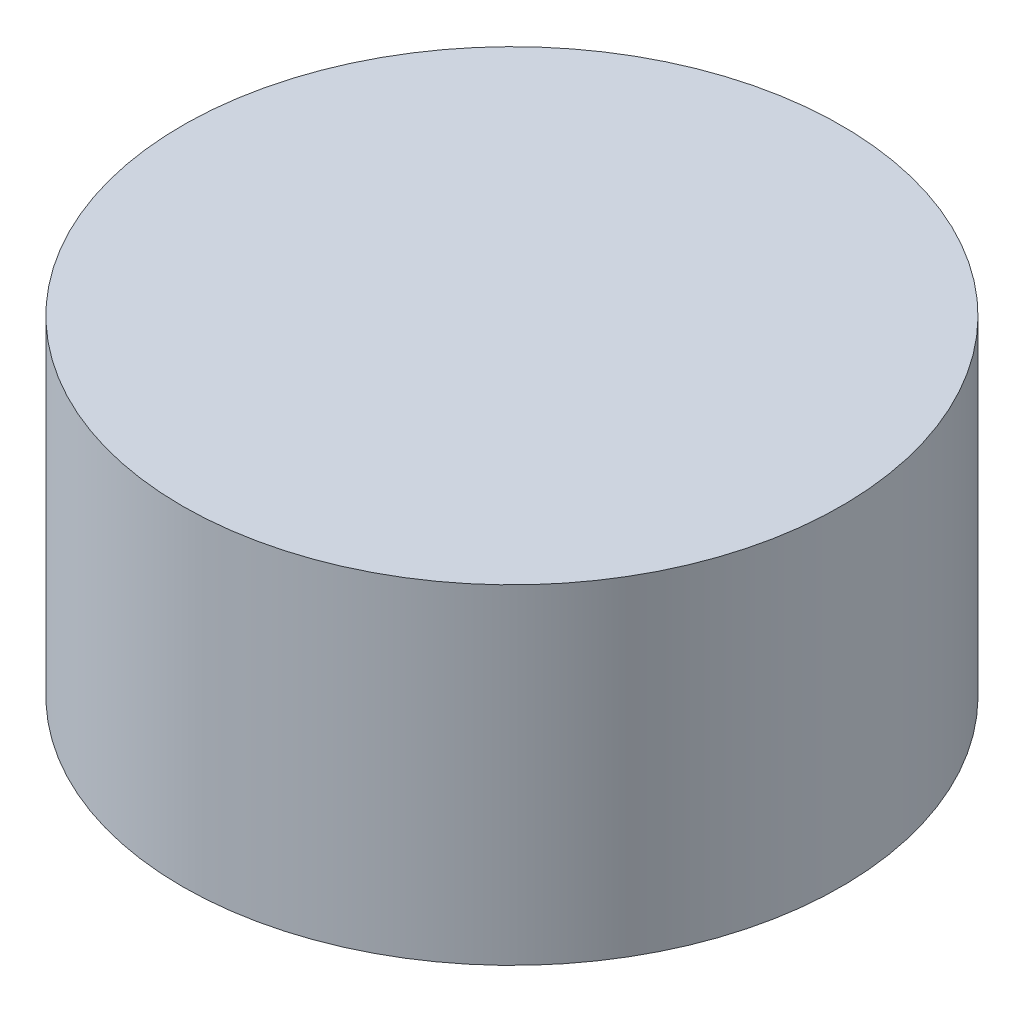
ISO-10303-21;
HEADER;
FILE_DESCRIPTION(('STEP AP214'),'2;1');
FILE_NAME('part.step','',(''),(''),'','','');
FILE_SCHEMA(('AUTOMOTIVE_DESIGN { 1 0 10303 214 1 1 1 1 }'));
ENDSEC;
DATA;
#1=APPLICATION_CONTEXT('core data for automotive mechanical design processes');
#2=APPLICATION_PROTOCOL_DEFINITION('international standard','automotive_design',2000,#1);
#3=PRODUCT_CONTEXT('',#1,'mechanical');
#4=PRODUCT('Part','Part','',(#3));
#5=PRODUCT_RELATED_PRODUCT_CATEGORY('part','',(#4));
#6=PRODUCT_DEFINITION_FORMATION('','',#4);
#7=PRODUCT_DEFINITION_CONTEXT('part definition',#1,'design');
#8=PRODUCT_DEFINITION('design','',#6,#7);
#9=PRODUCT_DEFINITION_SHAPE('','',#8);
#10=(LENGTH_UNIT() NAMED_UNIT(*) SI_UNIT(.MILLI.,.METRE.));
#11=(NAMED_UNIT(*) PLANE_ANGLE_UNIT() SI_UNIT($,.RADIAN.));
#12=(NAMED_UNIT(*) SI_UNIT($,.STERADIAN.) SOLID_ANGLE_UNIT());
#13=UNCERTAINTY_MEASURE_WITH_UNIT(LENGTH_MEASURE(1.E-05),#10,'distance_accuracy_value','');
#14=(GEOMETRIC_REPRESENTATION_CONTEXT(3) GLOBAL_UNCERTAINTY_ASSIGNED_CONTEXT((#13)) GLOBAL_UNIT_ASSIGNED_CONTEXT((#10,
#11,#12)) REPRESENTATION_CONTEXT('',''));
#15=CARTESIAN_POINT('',(0.,0.,0.));
#16=DIRECTION('',(0.,0.,1.));
#17=DIRECTION('',(1.,0.,0.));
#18=AXIS2_PLACEMENT_3D('',#15,#16,#17);
#19=CARTESIAN_POINT('',(0.,2.,0.));
#20=DIRECTION('',(0.,-1.,0.));
#21=DIRECTION('',(0.,0.,-1.));
#22=AXIS2_PLACEMENT_3D('',#19,#20,#21);
#23=CYLINDRICAL_SURFACE('',#22,2.);
#24=CARTESIAN_POINT('',(0.,2.,0.));
#25=DIRECTION('',(0.,1.,0.));
#26=DIRECTION('',(0.,0.,1.));
#27=AXIS2_PLACEMENT_3D('',#24,#25,#26);
#28=CIRCLE('',#27,2.);
#29=CARTESIAN_POINT('',(0.,2.,2.));
#30=VERTEX_POINT('',#29);
#31=EDGE_CURVE('E10',#30,#30,#28,.T.);
#32=ORIENTED_EDGE('',*,*,#31,.F.);
#33=EDGE_LOOP('',(#32));
#34=FACE_BOUND('',#33,.T.);
#35=CARTESIAN_POINT('',(0.,0.,0.));
#36=DIRECTION('',(0.,1.,0.));
#37=DIRECTION('',(0.,0.,1.));
#38=AXIS2_PLACEMENT_3D('',#35,#36,#37);
#39=CIRCLE('',#38,2.);
#40=CARTESIAN_POINT('',(0.,0.,2.));
#41=VERTEX_POINT('',#40);
#42=EDGE_CURVE('E33',#41,#41,#39,.T.);
#43=ORIENTED_EDGE('',*,*,#42,.T.);
#44=EDGE_LOOP('',(#43));
#45=FACE_BOUND('',#44,.T.);
#46=ADVANCED_FACE('F30',(#34,#45),#23,.T.);
#47=CARTESIAN_POINT('',(0.,2.,0.));
#48=DIRECTION('',(0.,1.,0.));
#49=DIRECTION('',(0.,0.,1.));
#50=AXIS2_PLACEMENT_3D('',#47,#48,#49);
#51=PLANE('',#50);
#52=ORIENTED_EDGE('',*,*,#31,.T.);
#53=EDGE_LOOP('',(#52));
#54=FACE_BOUND('',#53,.T.);
#55=ADVANCED_FACE('F45',(#54),#51,.T.);
#56=CARTESIAN_POINT('',(0.,0.,0.));
#57=DIRECTION('',(0.,1.,0.));
#58=DIRECTION('',(0.,0.,1.));
#59=AXIS2_PLACEMENT_3D('',#56,#57,#58);
#60=PLANE('',#59);
#61=ORIENTED_EDGE('',*,*,#42,.F.);
#62=EDGE_LOOP('',(#61));
#63=FACE_BOUND('',#62,.T.);
#64=ADVANCED_FACE('F43',(#63),#60,.F.);
#65=CLOSED_SHELL('',(#46,#55,#64));
#66=MANIFOLD_SOLID_BREP('B2',#65);
#67=ADVANCED_BREP_SHAPE_REPRESENTATION('',(#18,#66),#14);
#68=SHAPE_DEFINITION_REPRESENTATION(#9,#67);
ENDSEC;
END-ISO-10303-21;
